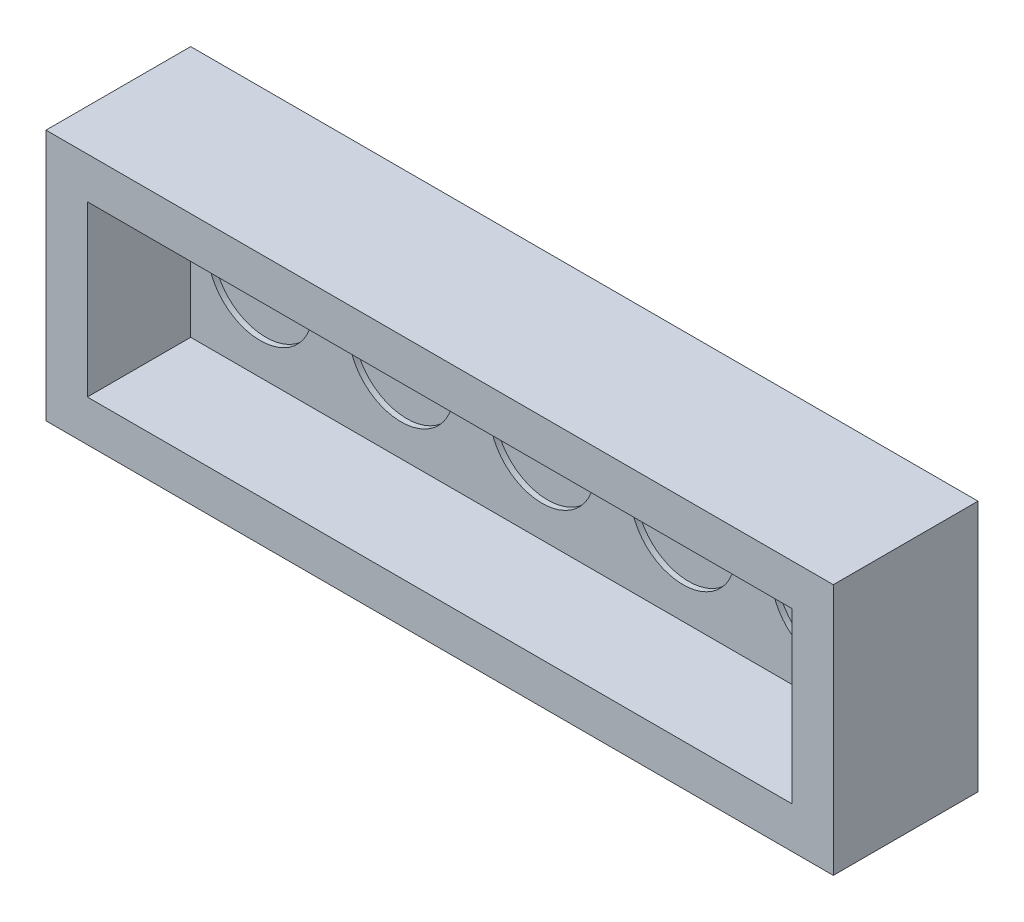
ISO-10303-21;
HEADER;
FILE_DESCRIPTION(('STEP AP214'),'2;1');
FILE_NAME('part.step','',(''),(''),'','','');
FILE_SCHEMA(('AUTOMOTIVE_DESIGN { 1 0 10303 214 1 1 1 1 }'));
ENDSEC;
DATA;
#1=APPLICATION_CONTEXT('core data for automotive mechanical design processes');
#2=APPLICATION_PROTOCOL_DEFINITION('international standard','automotive_design',2000,#1);
#3=PRODUCT_CONTEXT('',#1,'mechanical');
#4=PRODUCT('Part','Part','',(#3));
#5=PRODUCT_RELATED_PRODUCT_CATEGORY('part','',(#4));
#6=PRODUCT_DEFINITION_FORMATION('','',#4);
#7=PRODUCT_DEFINITION_CONTEXT('part definition',#1,'design');
#8=PRODUCT_DEFINITION('design','',#6,#7);
#9=PRODUCT_DEFINITION_SHAPE('','',#8);
#10=(LENGTH_UNIT() NAMED_UNIT(*) SI_UNIT(.MILLI.,.METRE.));
#11=(NAMED_UNIT(*) PLANE_ANGLE_UNIT() SI_UNIT($,.RADIAN.));
#12=(NAMED_UNIT(*) SI_UNIT($,.STERADIAN.) SOLID_ANGLE_UNIT());
#13=UNCERTAINTY_MEASURE_WITH_UNIT(LENGTH_MEASURE(1.E-05),#10,'distance_accuracy_value','');
#14=(GEOMETRIC_REPRESENTATION_CONTEXT(3) GLOBAL_UNCERTAINTY_ASSIGNED_CONTEXT((#13)) GLOBAL_UNIT_ASSIGNED_CONTEXT((#10,
#11,#12)) REPRESENTATION_CONTEXT('',''));
#15=CARTESIAN_POINT('',(0.,0.,0.));
#16=DIRECTION('',(0.,0.,1.));
#17=DIRECTION('',(1.,0.,0.));
#18=AXIS2_PLACEMENT_3D('',#15,#16,#17);
#19=CARTESIAN_POINT('',(0.,0.,22.));
#20=DIRECTION('',(1.,0.,0.));
#21=DIRECTION('',(0.,1.,0.));
#22=AXIS2_PLACEMENT_3D('',#19,#20,#21);
#23=PLANE('',#22);
#24=DIRECTION('',(0.,-1.,0.));
#25=VECTOR('',#24,1.);
#26=CARTESIAN_POINT('',(0.,0.,0.));
#27=LINE('',#26,#25);
#28=CARTESIAN_POINT('',(0.,0.,0.));
#29=VERTEX_POINT('',#28);
#30=CARTESIAN_POINT('',(0.,-134.,0.));
#31=VERTEX_POINT('',#30);
#32=EDGE_CURVE('E146',#29,#31,#27,.T.);
#33=ORIENTED_EDGE('',*,*,#32,.T.);
#34=DIRECTION('',(0.,0.,-1.));
#35=VECTOR('',#34,1.);
#36=CARTESIAN_POINT('',(0.,-134.,22.));
#37=LINE('',#36,#35);
#38=CARTESIAN_POINT('',(0.,-134.,77.));
#39=VERTEX_POINT('',#38);
#40=EDGE_CURVE('E11',#39,#31,#37,.T.);
#41=ORIENTED_EDGE('',*,*,#40,.F.);
#42=DIRECTION('',(0.,-1.,0.));
#43=VECTOR('',#42,1.);
#44=CARTESIAN_POINT('',(0.,-134.,77.));
#45=LINE('',#44,#43);
#46=CARTESIAN_POINT('',(0.,0.,77.));
#47=VERTEX_POINT('',#46);
#48=EDGE_CURVE('E143',#47,#39,#45,.T.);
#49=ORIENTED_EDGE('',*,*,#48,.F.);
#50=DIRECTION('',(0.,0.,-1.));
#51=VECTOR('',#50,1.);
#52=CARTESIAN_POINT('',(0.,0.,22.));
#53=LINE('',#52,#51);
#54=EDGE_CURVE('E155',#47,#29,#53,.T.);
#55=ORIENTED_EDGE('',*,*,#54,.T.);
#56=EDGE_LOOP('',(#33,#41,#49,#55));
#57=FACE_BOUND('',#56,.T.);
#58=ADVANCED_FACE('F33',(#57),#23,.F.);
#59=CARTESIAN_POINT('',(0.,-134.,22.));
#60=DIRECTION('',(0.,1.,0.));
#61=DIRECTION('',(0.,0.,1.));
#62=AXIS2_PLACEMENT_3D('',#59,#60,#61);
#63=PLANE('',#62);
#64=DIRECTION('',(1.,0.,0.));
#65=VECTOR('',#64,1.);
#66=CARTESIAN_POINT('',(0.,-134.,0.));
#67=LINE('',#66,#65);
#68=CARTESIAN_POINT('',(419.,-134.,0.));
#69=VERTEX_POINT('',#68);
#70=EDGE_CURVE('E149',#31,#69,#67,.T.);
#71=ORIENTED_EDGE('',*,*,#70,.T.);
#72=DIRECTION('',(0.,0.,-1.));
#73=VECTOR('',#72,1.);
#74=CARTESIAN_POINT('',(419.,-134.,22.));
#75=LINE('',#74,#73);
#76=CARTESIAN_POINT('',(419.,-134.,77.));
#77=VERTEX_POINT('',#76);
#78=EDGE_CURVE('E40',#77,#69,#75,.T.);
#79=ORIENTED_EDGE('',*,*,#78,.F.);
#80=DIRECTION('',(1.,0.,0.));
#81=VECTOR('',#80,1.);
#82=CARTESIAN_POINT('',(0.,-134.,77.));
#83=LINE('',#82,#81);
#84=EDGE_CURVE('E111',#39,#77,#83,.T.);
#85=ORIENTED_EDGE('',*,*,#84,.F.);
#86=ORIENTED_EDGE('',*,*,#40,.T.);
#87=EDGE_LOOP('',(#71,#79,#85,#86));
#88=FACE_BOUND('',#87,.T.);
#89=ADVANCED_FACE('F177',(#88),#63,.F.);
#90=CARTESIAN_POINT('',(419.,0.,22.));
#91=DIRECTION('',(-1.,0.,0.));
#92=DIRECTION('',(0.,0.,1.));
#93=AXIS2_PLACEMENT_3D('',#90,#91,#92);
#94=PLANE('',#93);
#95=DIRECTION('',(0.,1.,0.));
#96=VECTOR('',#95,1.);
#97=CARTESIAN_POINT('',(419.,0.,0.));
#98=LINE('',#97,#96);
#99=CARTESIAN_POINT('',(419.,0.,0.));
#100=VERTEX_POINT('',#99);
#101=EDGE_CURVE('E151',#69,#100,#98,.T.);
#102=ORIENTED_EDGE('',*,*,#101,.T.);
#103=DIRECTION('',(0.,0.,-1.));
#104=VECTOR('',#103,1.);
#105=CARTESIAN_POINT('',(419.,0.,22.));
#106=LINE('',#105,#104);
#107=CARTESIAN_POINT('',(419.,0.,77.));
#108=VERTEX_POINT('',#107);
#109=EDGE_CURVE('E158',#108,#100,#106,.T.);
#110=ORIENTED_EDGE('',*,*,#109,.F.);
#111=DIRECTION('',(0.,1.,0.));
#112=VECTOR('',#111,1.);
#113=CARTESIAN_POINT('',(419.,0.,77.));
#114=LINE('',#113,#112);
#115=EDGE_CURVE('E137',#77,#108,#114,.T.);
#116=ORIENTED_EDGE('',*,*,#115,.F.);
#117=ORIENTED_EDGE('',*,*,#78,.T.);
#118=EDGE_LOOP('',(#102,#110,#116,#117));
#119=FACE_BOUND('',#118,.T.);
#120=ADVANCED_FACE('F164',(#119),#94,.F.);
#121=CARTESIAN_POINT('',(0.,0.,22.));
#122=DIRECTION('',(0.,-1.,0.));
#123=DIRECTION('',(0.,0.,-1.));
#124=AXIS2_PLACEMENT_3D('',#121,#122,#123);
#125=PLANE('',#124);
#126=DIRECTION('',(-1.,0.,0.));
#127=VECTOR('',#126,1.);
#128=CARTESIAN_POINT('',(0.,0.,0.));
#129=LINE('',#128,#127);
#130=EDGE_CURVE('E153',#100,#29,#129,.T.);
#131=ORIENTED_EDGE('',*,*,#130,.T.);
#132=ORIENTED_EDGE('',*,*,#54,.F.);
#133=DIRECTION('',(-1.,0.,0.));
#134=VECTOR('',#133,1.);
#135=CARTESIAN_POINT('',(0.,0.,77.));
#136=LINE('',#135,#134);
#137=EDGE_CURVE('E140',#108,#47,#136,.T.);
#138=ORIENTED_EDGE('',*,*,#137,.F.);
#139=ORIENTED_EDGE('',*,*,#109,.T.);
#140=EDGE_LOOP('',(#131,#132,#138,#139));
#141=FACE_BOUND('',#140,.T.);
#142=ADVANCED_FACE('F172',(#141),#125,.F.);
#143=CARTESIAN_POINT('',(0.,0.,0.));
#144=DIRECTION('',(0.,0.,1.));
#145=DIRECTION('',(1.,0.,0.));
#146=AXIS2_PLACEMENT_3D('',#143,#144,#145);
#147=PLANE('',#146);
#148=ORIENTED_EDGE('',*,*,#32,.F.);
#149=ORIENTED_EDGE('',*,*,#130,.F.);
#150=ORIENTED_EDGE('',*,*,#101,.F.);
#151=ORIENTED_EDGE('',*,*,#70,.F.);
#152=EDGE_LOOP('',(#148,#149,#150,#151));
#153=FACE_BOUND('',#152,.T.);
#154=ADVANCED_FACE('F170',(#153),#147,.F.);
#155=CARTESIAN_POINT('',(0.,0.,77.));
#156=DIRECTION('',(0.,0.,-1.));
#157=DIRECTION('',(-1.,0.,0.));
#158=AXIS2_PLACEMENT_3D('',#155,#156,#157);
#159=PLANE('',#158);
#160=ORIENTED_EDGE('',*,*,#84,.T.);
#161=ORIENTED_EDGE('',*,*,#115,.T.);
#162=ORIENTED_EDGE('',*,*,#137,.T.);
#163=ORIENTED_EDGE('',*,*,#48,.T.);
#164=EDGE_LOOP('',(#160,#161,#162,#163));
#165=FACE_BOUND('',#164,.T.);
#166=DIRECTION('',(0.,-1.,0.));
#167=VECTOR('',#166,1.);
#168=CARTESIAN_POINT('',(22.,-22.,77.));
#169=LINE('',#168,#167);
#170=CARTESIAN_POINT('',(22.,-22.,77.));
#171=VERTEX_POINT('',#170);
#172=CARTESIAN_POINT('',(22.,-112.,77.));
#173=VERTEX_POINT('',#172);
#174=EDGE_CURVE('E96',#171,#173,#169,.T.);
#175=ORIENTED_EDGE('',*,*,#174,.F.);
#176=DIRECTION('',(-1.,0.,0.));
#177=VECTOR('',#176,1.);
#178=CARTESIAN_POINT('',(397.,-22.,77.));
#179=LINE('',#178,#177);
#180=CARTESIAN_POINT('',(397.,-22.,77.));
#181=VERTEX_POINT('',#180);
#182=EDGE_CURVE('E119',#181,#171,#179,.T.);
#183=ORIENTED_EDGE('',*,*,#182,.F.);
#184=DIRECTION('',(0.,1.,0.));
#185=VECTOR('',#184,1.);
#186=CARTESIAN_POINT('',(397.,-112.,77.));
#187=LINE('',#186,#185);
#188=CARTESIAN_POINT('',(397.,-112.,77.));
#189=VERTEX_POINT('',#188);
#190=EDGE_CURVE('E117',#189,#181,#187,.T.);
#191=ORIENTED_EDGE('',*,*,#190,.F.);
#192=DIRECTION('',(1.,0.,0.));
#193=VECTOR('',#192,1.);
#194=CARTESIAN_POINT('',(22.,-112.,77.));
#195=LINE('',#194,#193);
#196=EDGE_CURVE('E105',#173,#189,#195,.T.);
#197=ORIENTED_EDGE('',*,*,#196,.F.);
#198=EDGE_LOOP('',(#175,#183,#191,#197));
#199=FACE_BOUND('',#198,.T.);
#200=ADVANCED_FACE('F115',(#165,#199),#159,.F.);
#201=CARTESIAN_POINT('',(22.,-22.,77.));
#202=DIRECTION('',(1.,0.,0.));
#203=DIRECTION('',(0.,1.,0.));
#204=AXIS2_PLACEMENT_3D('',#201,#202,#203);
#205=PLANE('',#204);
#206=DIRECTION('',(0.,-1.,0.));
#207=VECTOR('',#206,1.);
#208=CARTESIAN_POINT('',(22.,-22.,22.));
#209=LINE('',#208,#207);
#210=CARTESIAN_POINT('',(22.,-22.,22.));
#211=VERTEX_POINT('',#210);
#212=CARTESIAN_POINT('',(22.,-112.,22.));
#213=VERTEX_POINT('',#212);
#214=EDGE_CURVE('E47',#211,#213,#209,.T.);
#215=ORIENTED_EDGE('',*,*,#214,.F.);
#216=DIRECTION('',(0.,0.,-1.));
#217=VECTOR('',#216,1.);
#218=CARTESIAN_POINT('',(22.,-22.,77.));
#219=LINE('',#218,#217);
#220=EDGE_CURVE('E101',#171,#211,#219,.T.);
#221=ORIENTED_EDGE('',*,*,#220,.F.);
#222=ORIENTED_EDGE('',*,*,#174,.T.);
#223=DIRECTION('',(0.,0.,-1.));
#224=VECTOR('',#223,1.);
#225=CARTESIAN_POINT('',(22.,-112.,77.));
#226=LINE('',#225,#224);
#227=EDGE_CURVE('E99',#173,#213,#226,.T.);
#228=ORIENTED_EDGE('',*,*,#227,.T.);
#229=EDGE_LOOP('',(#215,#221,#222,#228));
#230=FACE_BOUND('',#229,.T.);
#231=ADVANCED_FACE('F98',(#230),#205,.T.);
#232=CARTESIAN_POINT('',(22.,-112.,77.));
#233=DIRECTION('',(0.,1.,0.));
#234=DIRECTION('',(0.,0.,1.));
#235=AXIS2_PLACEMENT_3D('',#232,#233,#234);
#236=PLANE('',#235);
#237=DIRECTION('',(1.,0.,0.));
#238=VECTOR('',#237,1.);
#239=CARTESIAN_POINT('',(22.,-112.,22.));
#240=LINE('',#239,#238);
#241=CARTESIAN_POINT('',(397.,-112.,22.));
#242=VERTEX_POINT('',#241);
#243=EDGE_CURVE('E51',#213,#242,#240,.T.);
#244=ORIENTED_EDGE('',*,*,#243,.F.);
#245=ORIENTED_EDGE('',*,*,#227,.F.);
#246=ORIENTED_EDGE('',*,*,#196,.T.);
#247=DIRECTION('',(0.,0.,-1.));
#248=VECTOR('',#247,1.);
#249=CARTESIAN_POINT('',(397.,-112.,77.));
#250=LINE('',#249,#248);
#251=EDGE_CURVE('E112',#189,#242,#250,.T.);
#252=ORIENTED_EDGE('',*,*,#251,.T.);
#253=EDGE_LOOP('',(#244,#245,#246,#252));
#254=FACE_BOUND('',#253,.T.);
#255=ADVANCED_FACE('F109',(#254),#236,.T.);
#256=CARTESIAN_POINT('',(397.,-112.,77.));
#257=DIRECTION('',(-1.,0.,0.));
#258=DIRECTION('',(0.,0.,1.));
#259=AXIS2_PLACEMENT_3D('',#256,#257,#258);
#260=PLANE('',#259);
#261=DIRECTION('',(0.,1.,0.));
#262=VECTOR('',#261,1.);
#263=CARTESIAN_POINT('',(397.,-112.,22.));
#264=LINE('',#263,#262);
#265=CARTESIAN_POINT('',(397.,-22.,22.));
#266=VERTEX_POINT('',#265);
#267=EDGE_CURVE('E127',#242,#266,#264,.T.);
#268=ORIENTED_EDGE('',*,*,#267,.F.);
#269=ORIENTED_EDGE('',*,*,#251,.F.);
#270=ORIENTED_EDGE('',*,*,#190,.T.);
#271=DIRECTION('',(0.,0.,-1.));
#272=VECTOR('',#271,1.);
#273=CARTESIAN_POINT('',(397.,-22.,77.));
#274=LINE('',#273,#272);
#275=EDGE_CURVE('E131',#181,#266,#274,.T.);
#276=ORIENTED_EDGE('',*,*,#275,.T.);
#277=EDGE_LOOP('',(#268,#269,#270,#276));
#278=FACE_BOUND('',#277,.T.);
#279=ADVANCED_FACE('F201',(#278),#260,.T.);
#280=CARTESIAN_POINT('',(397.,-22.,77.));
#281=DIRECTION('',(0.,-1.,0.));
#282=DIRECTION('',(1.,0.,0.));
#283=AXIS2_PLACEMENT_3D('',#280,#281,#282);
#284=PLANE('',#283);
#285=DIRECTION('',(-1.,0.,0.));
#286=VECTOR('',#285,1.);
#287=CARTESIAN_POINT('',(397.,-22.,22.));
#288=LINE('',#287,#286);
#289=EDGE_CURVE('E106',#266,#211,#288,.T.);
#290=ORIENTED_EDGE('',*,*,#289,.F.);
#291=ORIENTED_EDGE('',*,*,#275,.F.);
#292=ORIENTED_EDGE('',*,*,#182,.T.);
#293=ORIENTED_EDGE('',*,*,#220,.T.);
#294=EDGE_LOOP('',(#290,#291,#292,#293));
#295=FACE_BOUND('',#294,.T.);
#296=ADVANCED_FACE('F193',(#295),#284,.T.);
#297=CARTESIAN_POINT('',(0.,0.,22.));
#298=DIRECTION('',(0.,0.,1.));
#299=DIRECTION('',(1.,0.,0.));
#300=AXIS2_PLACEMENT_3D('',#297,#298,#299);
#301=PLANE('',#300);
#302=CARTESIAN_POINT('',(59.,-67.,22.));
#303=DIRECTION('',(0.,0.,1.));
#304=DIRECTION('',(1.,0.,0.));
#305=AXIS2_PLACEMENT_3D('',#302,#303,#304);
#306=CIRCLE('',#305,28.);
#307=CARTESIAN_POINT('',(87.,-67.,22.));
#308=VERTEX_POINT('',#307);
#309=EDGE_CURVE('E250',#308,#308,#306,.T.);
#310=ORIENTED_EDGE('',*,*,#309,.F.);
#311=EDGE_LOOP('',(#310));
#312=FACE_BOUND('',#311,.T.);
#313=CARTESIAN_POINT('',(134.,-67.,22.));
#314=DIRECTION('',(0.,0.,1.));
#315=DIRECTION('',(1.,0.,0.));
#316=AXIS2_PLACEMENT_3D('',#313,#314,#315);
#317=CIRCLE('',#316,28.);
#318=CARTESIAN_POINT('',(162.,-67.,22.));
#319=VERTEX_POINT('',#318);
#320=EDGE_CURVE('E258',#319,#319,#317,.T.);
#321=ORIENTED_EDGE('',*,*,#320,.F.);
#322=EDGE_LOOP('',(#321));
#323=FACE_BOUND('',#322,.T.);
#324=CARTESIAN_POINT('',(209.,-67.,22.));
#325=DIRECTION('',(0.,0.,1.));
#326=DIRECTION('',(1.,0.,0.));
#327=AXIS2_PLACEMENT_3D('',#324,#325,#326);
#328=CIRCLE('',#327,28.);
#329=CARTESIAN_POINT('',(237.,-67.,22.));
#330=VERTEX_POINT('',#329);
#331=EDGE_CURVE('E264',#330,#330,#328,.T.);
#332=ORIENTED_EDGE('',*,*,#331,.F.);
#333=EDGE_LOOP('',(#332));
#334=FACE_BOUND('',#333,.T.);
#335=CARTESIAN_POINT('',(284.,-67.,22.));
#336=DIRECTION('',(0.,0.,1.));
#337=DIRECTION('',(1.,0.,0.));
#338=AXIS2_PLACEMENT_3D('',#335,#336,#337);
#339=CIRCLE('',#338,28.);
#340=CARTESIAN_POINT('',(312.,-67.,22.));
#341=VERTEX_POINT('',#340);
#342=EDGE_CURVE('E270',#341,#341,#339,.T.);
#343=ORIENTED_EDGE('',*,*,#342,.F.);
#344=EDGE_LOOP('',(#343));
#345=FACE_BOUND('',#344,.T.);
#346=CARTESIAN_POINT('',(359.,-67.,22.));
#347=DIRECTION('',(0.,0.,1.));
#348=DIRECTION('',(1.,0.,0.));
#349=AXIS2_PLACEMENT_3D('',#346,#347,#348);
#350=CIRCLE('',#349,28.);
#351=CARTESIAN_POINT('',(387.,-67.,22.));
#352=VERTEX_POINT('',#351);
#353=EDGE_CURVE('E275',#352,#352,#350,.T.);
#354=ORIENTED_EDGE('',*,*,#353,.F.);
#355=EDGE_LOOP('',(#354));
#356=FACE_BOUND('',#355,.T.);
#357=ORIENTED_EDGE('',*,*,#214,.T.);
#358=ORIENTED_EDGE('',*,*,#243,.T.);
#359=ORIENTED_EDGE('',*,*,#267,.T.);
#360=ORIENTED_EDGE('',*,*,#289,.T.);
#361=EDGE_LOOP('',(#357,#358,#359,#360));
#362=FACE_BOUND('',#361,.T.);
#363=ADVANCED_FACE('F189',(#312,#323,#334,#345,#356,#362),#301,.T.);
#364=CARTESIAN_POINT('',(359.,-67.,19.));
#365=DIRECTION('',(0.,0.,1.));
#366=DIRECTION('',(1.,0.,0.));
#367=AXIS2_PLACEMENT_3D('',#364,#365,#366);
#368=CYLINDRICAL_SURFACE('',#367,28.);
#369=CARTESIAN_POINT('',(359.,-67.,19.));
#370=DIRECTION('',(0.,0.,1.));
#371=DIRECTION('',(1.,0.,0.));
#372=AXIS2_PLACEMENT_3D('',#369,#370,#371);
#373=CIRCLE('',#372,28.);
#374=CARTESIAN_POINT('',(387.,-67.,19.));
#375=VERTEX_POINT('',#374);
#376=EDGE_CURVE('E273',#375,#375,#373,.T.);
#377=ORIENTED_EDGE('',*,*,#376,.F.);
#378=EDGE_LOOP('',(#377));
#379=FACE_BOUND('',#378,.T.);
#380=ORIENTED_EDGE('',*,*,#353,.T.);
#381=EDGE_LOOP('',(#380));
#382=FACE_BOUND('',#381,.T.);
#383=ADVANCED_FACE('F192',(#379,#382),#368,.F.);
#384=CARTESIAN_POINT('',(359.,-67.,19.));
#385=DIRECTION('',(0.,0.,1.));
#386=DIRECTION('',(1.,0.,0.));
#387=AXIS2_PLACEMENT_3D('',#384,#385,#386);
#388=PLANE('',#387);
#389=ORIENTED_EDGE('',*,*,#376,.T.);
#390=EDGE_LOOP('',(#389));
#391=FACE_BOUND('',#390,.T.);
#392=ADVANCED_FACE('F210',(#391),#388,.T.);
#393=CARTESIAN_POINT('',(284.,-67.,19.));
#394=DIRECTION('',(0.,0.,1.));
#395=DIRECTION('',(1.,0.,0.));
#396=AXIS2_PLACEMENT_3D('',#393,#394,#395);
#397=CYLINDRICAL_SURFACE('',#396,28.);
#398=CARTESIAN_POINT('',(284.,-67.,19.));
#399=DIRECTION('',(0.,0.,1.));
#400=DIRECTION('',(1.,0.,0.));
#401=AXIS2_PLACEMENT_3D('',#398,#399,#400);
#402=CIRCLE('',#401,28.);
#403=CARTESIAN_POINT('',(312.,-67.,19.));
#404=VERTEX_POINT('',#403);
#405=EDGE_CURVE('E267',#404,#404,#402,.T.);
#406=ORIENTED_EDGE('',*,*,#405,.F.);
#407=EDGE_LOOP('',(#406));
#408=FACE_BOUND('',#407,.T.);
#409=ORIENTED_EDGE('',*,*,#342,.T.);
#410=EDGE_LOOP('',(#409));
#411=FACE_BOUND('',#410,.T.);
#412=ADVANCED_FACE('F214',(#408,#411),#397,.F.);
#413=CARTESIAN_POINT('',(284.,-67.,19.));
#414=DIRECTION('',(0.,0.,1.));
#415=DIRECTION('',(1.,0.,0.));
#416=AXIS2_PLACEMENT_3D('',#413,#414,#415);
#417=PLANE('',#416);
#418=ORIENTED_EDGE('',*,*,#405,.T.);
#419=EDGE_LOOP('',(#418));
#420=FACE_BOUND('',#419,.T.);
#421=ADVANCED_FACE('F218',(#420),#417,.T.);
#422=CARTESIAN_POINT('',(209.,-67.,19.));
#423=DIRECTION('',(0.,0.,1.));
#424=DIRECTION('',(1.,0.,0.));
#425=AXIS2_PLACEMENT_3D('',#422,#423,#424);
#426=CYLINDRICAL_SURFACE('',#425,28.);
#427=CARTESIAN_POINT('',(209.,-67.,19.));
#428=DIRECTION('',(0.,0.,1.));
#429=DIRECTION('',(1.,0.,0.));
#430=AXIS2_PLACEMENT_3D('',#427,#428,#429);
#431=CIRCLE('',#430,28.);
#432=CARTESIAN_POINT('',(237.,-67.,19.));
#433=VERTEX_POINT('',#432);
#434=EDGE_CURVE('E261',#433,#433,#431,.T.);
#435=ORIENTED_EDGE('',*,*,#434,.F.);
#436=EDGE_LOOP('',(#435));
#437=FACE_BOUND('',#436,.T.);
#438=ORIENTED_EDGE('',*,*,#331,.T.);
#439=EDGE_LOOP('',(#438));
#440=FACE_BOUND('',#439,.T.);
#441=ADVANCED_FACE('F222',(#437,#440),#426,.F.);
#442=CARTESIAN_POINT('',(209.,-67.,19.));
#443=DIRECTION('',(0.,0.,1.));
#444=DIRECTION('',(1.,0.,0.));
#445=AXIS2_PLACEMENT_3D('',#442,#443,#444);
#446=PLANE('',#445);
#447=ORIENTED_EDGE('',*,*,#434,.T.);
#448=EDGE_LOOP('',(#447));
#449=FACE_BOUND('',#448,.T.);
#450=ADVANCED_FACE('F226',(#449),#446,.T.);
#451=CARTESIAN_POINT('',(134.,-67.,19.));
#452=DIRECTION('',(0.,0.,1.));
#453=DIRECTION('',(1.,0.,0.));
#454=AXIS2_PLACEMENT_3D('',#451,#452,#453);
#455=CYLINDRICAL_SURFACE('',#454,28.);
#456=CARTESIAN_POINT('',(134.,-67.,19.));
#457=DIRECTION('',(0.,0.,1.));
#458=DIRECTION('',(1.,0.,0.));
#459=AXIS2_PLACEMENT_3D('',#456,#457,#458);
#460=CIRCLE('',#459,28.);
#461=CARTESIAN_POINT('',(162.,-67.,19.));
#462=VERTEX_POINT('',#461);
#463=EDGE_CURVE('E253',#462,#462,#460,.T.);
#464=ORIENTED_EDGE('',*,*,#463,.F.);
#465=EDGE_LOOP('',(#464));
#466=FACE_BOUND('',#465,.T.);
#467=ORIENTED_EDGE('',*,*,#320,.T.);
#468=EDGE_LOOP('',(#467));
#469=FACE_BOUND('',#468,.T.);
#470=ADVANCED_FACE('F230',(#466,#469),#455,.F.);
#471=CARTESIAN_POINT('',(134.,-67.,19.));
#472=DIRECTION('',(0.,0.,1.));
#473=DIRECTION('',(1.,0.,0.));
#474=AXIS2_PLACEMENT_3D('',#471,#472,#473);
#475=PLANE('',#474);
#476=ORIENTED_EDGE('',*,*,#463,.T.);
#477=EDGE_LOOP('',(#476));
#478=FACE_BOUND('',#477,.T.);
#479=ADVANCED_FACE('F234',(#478),#475,.T.);
#480=CARTESIAN_POINT('',(59.,-67.,19.));
#481=DIRECTION('',(0.,0.,1.));
#482=DIRECTION('',(1.,0.,0.));
#483=AXIS2_PLACEMENT_3D('',#480,#481,#482);
#484=CYLINDRICAL_SURFACE('',#483,28.);
#485=CARTESIAN_POINT('',(59.,-67.,19.));
#486=DIRECTION('',(0.,0.,1.));
#487=DIRECTION('',(1.,0.,0.));
#488=AXIS2_PLACEMENT_3D('',#485,#486,#487);
#489=CIRCLE('',#488,28.);
#490=CARTESIAN_POINT('',(87.,-67.,19.));
#491=VERTEX_POINT('',#490);
#492=EDGE_CURVE('E125',#491,#491,#489,.T.);
#493=ORIENTED_EDGE('',*,*,#492,.F.);
#494=EDGE_LOOP('',(#493));
#495=FACE_BOUND('',#494,.T.);
#496=ORIENTED_EDGE('',*,*,#309,.T.);
#497=EDGE_LOOP('',(#496));
#498=FACE_BOUND('',#497,.T.);
#499=ADVANCED_FACE('F238',(#495,#498),#484,.F.);
#500=CARTESIAN_POINT('',(59.,-67.,19.));
#501=DIRECTION('',(0.,0.,1.));
#502=DIRECTION('',(1.,0.,0.));
#503=AXIS2_PLACEMENT_3D('',#500,#501,#502);
#504=PLANE('',#503);
#505=ORIENTED_EDGE('',*,*,#492,.T.);
#506=EDGE_LOOP('',(#505));
#507=FACE_BOUND('',#506,.T.);
#508=ADVANCED_FACE('F242',(#507),#504,.T.);
#509=CLOSED_SHELL('',(#58,#89,#120,#142,#154,#200,#231,#255,#279,#296,#363,#383,#392,#412,#421,
#441,#450,#470,#479,#499,#508));
#510=MANIFOLD_SOLID_BREP('B2',#509);
#511=ADVANCED_BREP_SHAPE_REPRESENTATION('',(#18,#510),#14);
#512=SHAPE_DEFINITION_REPRESENTATION(#9,#511);
ENDSEC;
END-ISO-10303-21;
